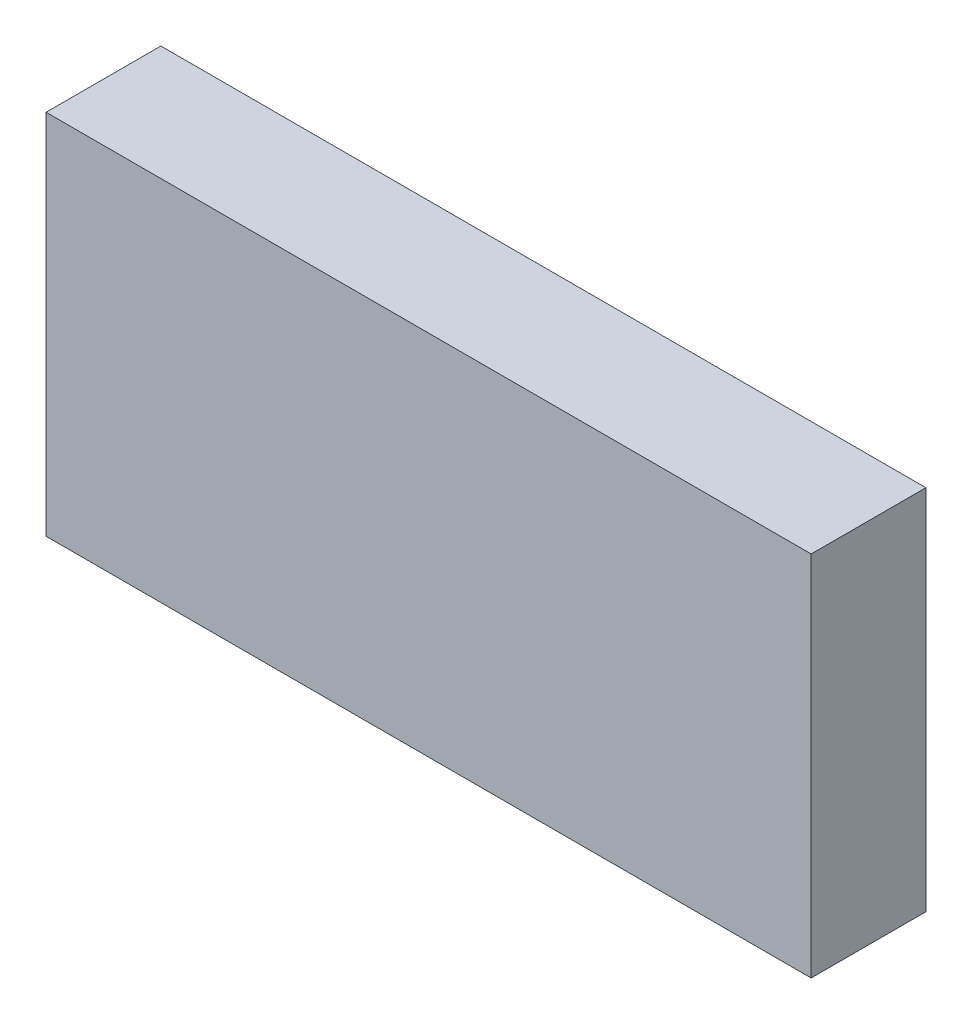
ISO-10303-21;
HEADER;
FILE_DESCRIPTION(('STEP AP214'),'2;1');
FILE_NAME('part.step','',(''),(''),'','','');
FILE_SCHEMA(('AUTOMOTIVE_DESIGN { 1 0 10303 214 1 1 1 1 }'));
ENDSEC;
DATA;
#1=APPLICATION_CONTEXT('core data for automotive mechanical design processes');
#2=APPLICATION_PROTOCOL_DEFINITION('international standard','automotive_design',2000,#1);
#3=PRODUCT_CONTEXT('',#1,'mechanical');
#4=PRODUCT('Part','Part','',(#3));
#5=PRODUCT_RELATED_PRODUCT_CATEGORY('part','',(#4));
#6=PRODUCT_DEFINITION_FORMATION('','',#4);
#7=PRODUCT_DEFINITION_CONTEXT('part definition',#1,'design');
#8=PRODUCT_DEFINITION('design','',#6,#7);
#9=PRODUCT_DEFINITION_SHAPE('','',#8);
#10=(LENGTH_UNIT() NAMED_UNIT(*) SI_UNIT(.MILLI.,.METRE.));
#11=(NAMED_UNIT(*) PLANE_ANGLE_UNIT() SI_UNIT($,.RADIAN.));
#12=(NAMED_UNIT(*) SI_UNIT($,.STERADIAN.) SOLID_ANGLE_UNIT());
#13=UNCERTAINTY_MEASURE_WITH_UNIT(LENGTH_MEASURE(1.E-05),#10,'distance_accuracy_value','');
#14=(GEOMETRIC_REPRESENTATION_CONTEXT(3) GLOBAL_UNCERTAINTY_ASSIGNED_CONTEXT((#13)) GLOBAL_UNIT_ASSIGNED_CONTEXT((#10,
#11,#12)) REPRESENTATION_CONTEXT('',''));
#15=CARTESIAN_POINT('',(0.,0.,0.));
#16=DIRECTION('',(0.,0.,1.));
#17=DIRECTION('',(1.,0.,0.));
#18=AXIS2_PLACEMENT_3D('',#15,#16,#17);
#19=CARTESIAN_POINT('',(-2.54,1.2192,0.762));
#20=DIRECTION('',(0.,0.,1.));
#21=DIRECTION('',(1.,0.,0.));
#22=AXIS2_PLACEMENT_3D('',#19,#20,#21);
#23=PLANE('',#22);
#24=DIRECTION('',(0.,1.,0.));
#25=VECTOR('',#24,1.);
#26=CARTESIAN_POINT('',(2.54,1.2192,0.762));
#27=LINE('',#26,#25);
#28=CARTESIAN_POINT('',(2.54,1.2192,0.762));
#29=VERTEX_POINT('',#28);
#30=CARTESIAN_POINT('',(2.54,-1.2192,0.762));
#31=VERTEX_POINT('',#30);
#32=EDGE_CURVE('E53',#29,#31,#27,.F.);
#33=ORIENTED_EDGE('',*,*,#32,.F.);
#34=DIRECTION('',(1.,0.,0.));
#35=VECTOR('',#34,1.);
#36=CARTESIAN_POINT('',(-2.54,1.2192,0.762));
#37=LINE('',#36,#35);
#38=CARTESIAN_POINT('',(-2.54,1.2192,0.762));
#39=VERTEX_POINT('',#38);
#40=EDGE_CURVE('E68',#39,#29,#37,.T.);
#41=ORIENTED_EDGE('',*,*,#40,.F.);
#42=DIRECTION('',(0.,1.,0.));
#43=VECTOR('',#42,1.);
#44=CARTESIAN_POINT('',(-2.54,-1.2192,0.762));
#45=LINE('',#44,#43);
#46=CARTESIAN_POINT('',(-2.54,-1.2192,0.762));
#47=VERTEX_POINT('',#46);
#48=EDGE_CURVE('E20',#47,#39,#45,.T.);
#49=ORIENTED_EDGE('',*,*,#48,.F.);
#50=DIRECTION('',(1.,0.,0.));
#51=VECTOR('',#50,1.);
#52=CARTESIAN_POINT('',(2.54,-1.2192,0.762));
#53=LINE('',#52,#51);
#54=EDGE_CURVE('E58',#31,#47,#53,.F.);
#55=ORIENTED_EDGE('',*,*,#54,.F.);
#56=EDGE_LOOP('',(#33,#41,#49,#55));
#57=FACE_BOUND('',#56,.T.);
#58=ADVANCED_FACE('F17',(#57),#23,.T.);
#59=CARTESIAN_POINT('',(-2.54,-1.2192,0.));
#60=DIRECTION('',(-1.,0.,0.));
#61=DIRECTION('',(0.,0.,1.));
#62=AXIS2_PLACEMENT_3D('',#59,#60,#61);
#63=PLANE('',#62);
#64=DIRECTION('',(0.,0.,1.));
#65=VECTOR('',#64,1.);
#66=CARTESIAN_POINT('',(-2.54,1.2192,0.));
#67=LINE('',#66,#65);
#68=CARTESIAN_POINT('',(-2.54,1.2192,0.));
#69=VERTEX_POINT('',#68);
#70=EDGE_CURVE('E79',#69,#39,#67,.T.);
#71=ORIENTED_EDGE('',*,*,#70,.F.);
#72=DIRECTION('',(0.,1.,0.));
#73=VECTOR('',#72,1.);
#74=CARTESIAN_POINT('',(-2.54,1.2192,0.));
#75=LINE('',#74,#73);
#76=CARTESIAN_POINT('',(-2.54,-1.2192,0.));
#77=VERTEX_POINT('',#76);
#78=EDGE_CURVE('E74',#69,#77,#75,.F.);
#79=ORIENTED_EDGE('',*,*,#78,.T.);
#80=DIRECTION('',(0.,0.,-1.));
#81=VECTOR('',#80,1.);
#82=CARTESIAN_POINT('',(-2.54,-1.2192,0.));
#83=LINE('',#82,#81);
#84=EDGE_CURVE('E63',#47,#77,#83,.T.);
#85=ORIENTED_EDGE('',*,*,#84,.F.);
#86=ORIENTED_EDGE('',*,*,#48,.T.);
#87=EDGE_LOOP('',(#71,#79,#85,#86));
#88=FACE_BOUND('',#87,.T.);
#89=ADVANCED_FACE('F73',(#88),#63,.T.);
#90=CARTESIAN_POINT('',(2.54,-1.2192,0.));
#91=DIRECTION('',(0.,-1.,0.));
#92=DIRECTION('',(0.,0.,-1.));
#93=AXIS2_PLACEMENT_3D('',#90,#91,#92);
#94=PLANE('',#93);
#95=ORIENTED_EDGE('',*,*,#84,.T.);
#96=DIRECTION('',(1.,0.,0.));
#97=VECTOR('',#96,1.);
#98=CARTESIAN_POINT('',(-2.54,-1.2192,0.));
#99=LINE('',#98,#97);
#100=CARTESIAN_POINT('',(2.54,-1.2192,0.));
#101=VERTEX_POINT('',#100);
#102=EDGE_CURVE('E84',#77,#101,#99,.T.);
#103=ORIENTED_EDGE('',*,*,#102,.T.);
#104=DIRECTION('',(0.,0.,-1.));
#105=VECTOR('',#104,1.);
#106=CARTESIAN_POINT('',(2.54,-1.2192,0.));
#107=LINE('',#106,#105);
#108=EDGE_CURVE('E65',#31,#101,#107,.T.);
#109=ORIENTED_EDGE('',*,*,#108,.F.);
#110=ORIENTED_EDGE('',*,*,#54,.T.);
#111=EDGE_LOOP('',(#95,#103,#109,#110));
#112=FACE_BOUND('',#111,.T.);
#113=ADVANCED_FACE('F60',(#112),#94,.T.);
#114=CARTESIAN_POINT('',(2.54,1.2192,0.));
#115=DIRECTION('',(1.,0.,0.));
#116=DIRECTION('',(0.,0.,-1.));
#117=AXIS2_PLACEMENT_3D('',#114,#115,#116);
#118=PLANE('',#117);
#119=ORIENTED_EDGE('',*,*,#108,.T.);
#120=DIRECTION('',(0.,1.,0.));
#121=VECTOR('',#120,1.);
#122=CARTESIAN_POINT('',(2.54,1.2192,0.));
#123=LINE('',#122,#121);
#124=CARTESIAN_POINT('',(2.54,1.2192,0.));
#125=VERTEX_POINT('',#124);
#126=EDGE_CURVE('E26',#101,#125,#123,.T.);
#127=ORIENTED_EDGE('',*,*,#126,.T.);
#128=DIRECTION('',(0.,0.,1.));
#129=VECTOR('',#128,1.);
#130=CARTESIAN_POINT('',(2.54,1.2192,0.));
#131=LINE('',#130,#129);
#132=EDGE_CURVE('E34',#29,#125,#131,.F.);
#133=ORIENTED_EDGE('',*,*,#132,.F.);
#134=ORIENTED_EDGE('',*,*,#32,.T.);
#135=EDGE_LOOP('',(#119,#127,#133,#134));
#136=FACE_BOUND('',#135,.T.);
#137=ADVANCED_FACE('F88',(#136),#118,.T.);
#138=CARTESIAN_POINT('',(-2.54,1.2192,0.));
#139=DIRECTION('',(0.,1.,0.));
#140=DIRECTION('',(0.,0.,1.));
#141=AXIS2_PLACEMENT_3D('',#138,#139,#140);
#142=PLANE('',#141);
#143=ORIENTED_EDGE('',*,*,#132,.T.);
#144=DIRECTION('',(1.,0.,0.));
#145=VECTOR('',#144,1.);
#146=CARTESIAN_POINT('',(-2.54,1.2192,0.));
#147=LINE('',#146,#145);
#148=EDGE_CURVE('E11',#125,#69,#147,.F.);
#149=ORIENTED_EDGE('',*,*,#148,.T.);
#150=ORIENTED_EDGE('',*,*,#70,.T.);
#151=ORIENTED_EDGE('',*,*,#40,.T.);
#152=EDGE_LOOP('',(#143,#149,#150,#151));
#153=FACE_BOUND('',#152,.T.);
#154=ADVANCED_FACE('F91',(#153),#142,.T.);
#155=CARTESIAN_POINT('',(-2.54,1.2192,0.));
#156=DIRECTION('',(0.,0.,1.));
#157=DIRECTION('',(1.,0.,0.));
#158=AXIS2_PLACEMENT_3D('',#155,#156,#157);
#159=PLANE('',#158);
#160=ORIENTED_EDGE('',*,*,#126,.F.);
#161=ORIENTED_EDGE('',*,*,#102,.F.);
#162=ORIENTED_EDGE('',*,*,#78,.F.);
#163=ORIENTED_EDGE('',*,*,#148,.F.);
#164=EDGE_LOOP('',(#160,#161,#162,#163));
#165=FACE_BOUND('',#164,.T.);
#166=ADVANCED_FACE('F90',(#165),#159,.F.);
#167=CLOSED_SHELL('',(#58,#89,#113,#137,#154,#166));
#168=MANIFOLD_SOLID_BREP('B1',#167);
#169=ADVANCED_BREP_SHAPE_REPRESENTATION('',(#18,#168),#14);
#170=SHAPE_DEFINITION_REPRESENTATION(#9,#169);
ENDSEC;
END-ISO-10303-21;
